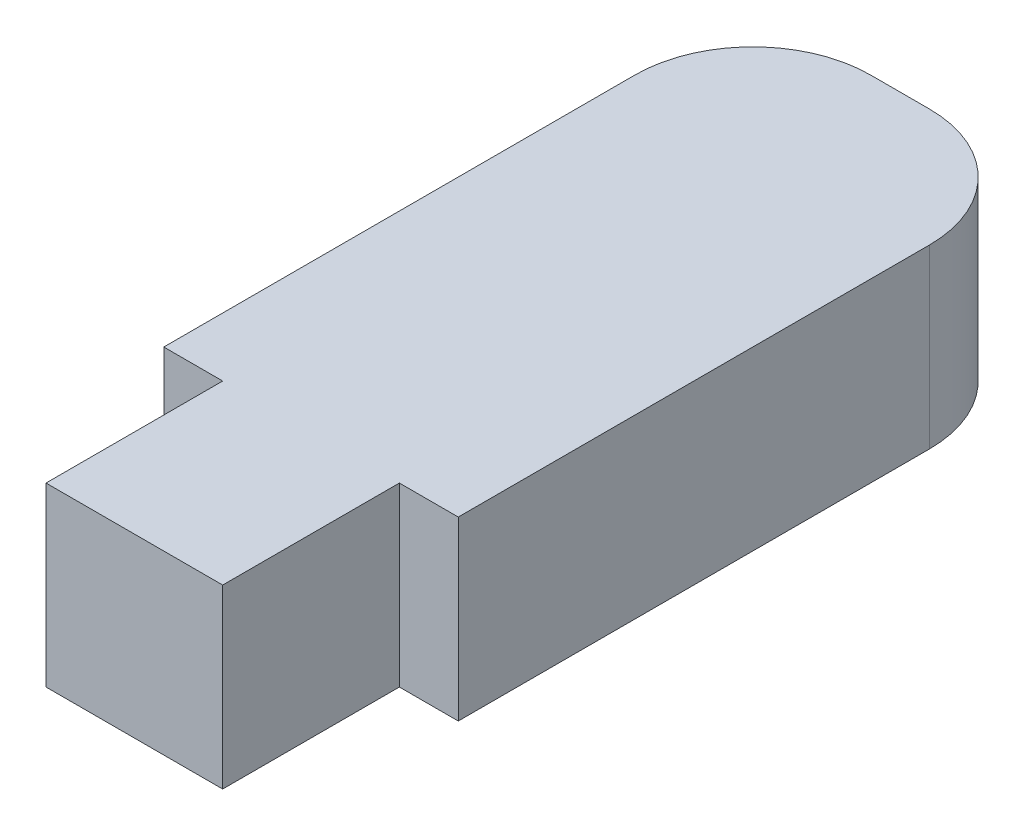
ISO-10303-21;
HEADER;
FILE_DESCRIPTION(('STEP AP214'),'2;1');
FILE_NAME('part.step','',(''),(''),'','','');
FILE_SCHEMA(('AUTOMOTIVE_DESIGN { 1 0 10303 214 1 1 1 1 }'));
ENDSEC;
DATA;
#1=APPLICATION_CONTEXT('core data for automotive mechanical design processes');
#2=APPLICATION_PROTOCOL_DEFINITION('international standard','automotive_design',2000,#1);
#3=PRODUCT_CONTEXT('',#1,'mechanical');
#4=PRODUCT('Part','Part','',(#3));
#5=PRODUCT_RELATED_PRODUCT_CATEGORY('part','',(#4));
#6=PRODUCT_DEFINITION_FORMATION('','',#4);
#7=PRODUCT_DEFINITION_CONTEXT('part definition',#1,'design');
#8=PRODUCT_DEFINITION('design','',#6,#7);
#9=PRODUCT_DEFINITION_SHAPE('','',#8);
#10=(LENGTH_UNIT() NAMED_UNIT(*) SI_UNIT(.MILLI.,.METRE.));
#11=(NAMED_UNIT(*) PLANE_ANGLE_UNIT() SI_UNIT($,.RADIAN.));
#12=(NAMED_UNIT(*) SI_UNIT($,.STERADIAN.) SOLID_ANGLE_UNIT());
#13=UNCERTAINTY_MEASURE_WITH_UNIT(LENGTH_MEASURE(1.E-05),#10,'distance_accuracy_value','');
#14=(GEOMETRIC_REPRESENTATION_CONTEXT(3) GLOBAL_UNCERTAINTY_ASSIGNED_CONTEXT((#13)) GLOBAL_UNIT_ASSIGNED_CONTEXT((#10,
#11,#12)) REPRESENTATION_CONTEXT('',''));
#15=CARTESIAN_POINT('',(0.,0.,0.));
#16=DIRECTION('',(0.,0.,1.));
#17=DIRECTION('',(1.,0.,0.));
#18=AXIS2_PLACEMENT_3D('',#15,#16,#17);
#19=CARTESIAN_POINT('',(0.,3.,0.));
#20=DIRECTION('',(-1.,0.,0.));
#21=DIRECTION('',(0.,0.,1.));
#22=AXIS2_PLACEMENT_3D('',#19,#20,#21);
#23=PLANE('',#22);
#24=DIRECTION('',(0.,0.,-1.));
#25=VECTOR('',#24,1.);
#26=CARTESIAN_POINT('',(0.,0.,0.));
#27=LINE('',#26,#25);
#28=CARTESIAN_POINT('',(0.,0.,0.));
#29=VERTEX_POINT('',#28);
#30=CARTESIAN_POINT('',(0.,0.,-7.99999999999999));
#31=VERTEX_POINT('',#30);
#32=EDGE_CURVE('E141',#29,#31,#27,.T.);
#33=ORIENTED_EDGE('',*,*,#32,.T.);
#34=DIRECTION('',(0.,-1.,0.));
#35=VECTOR('',#34,1.);
#36=CARTESIAN_POINT('',(0.,3.,-7.99999999999999));
#37=LINE('',#36,#35);
#38=CARTESIAN_POINT('',(0.,3.,-7.99999999999999));
#39=VERTEX_POINT('',#38);
#40=EDGE_CURVE('E11',#39,#31,#37,.T.);
#41=ORIENTED_EDGE('',*,*,#40,.F.);
#42=DIRECTION('',(0.,0.,-1.));
#43=VECTOR('',#42,1.);
#44=CARTESIAN_POINT('',(0.,3.,0.));
#45=LINE('',#44,#43);
#46=CARTESIAN_POINT('',(0.,3.,0.));
#47=VERTEX_POINT('',#46);
#48=EDGE_CURVE('E159',#47,#39,#45,.T.);
#49=ORIENTED_EDGE('',*,*,#48,.F.);
#50=DIRECTION('',(0.,-1.,0.));
#51=VECTOR('',#50,1.);
#52=CARTESIAN_POINT('',(0.,3.,0.));
#53=LINE('',#52,#51);
#54=EDGE_CURVE('E137',#47,#29,#53,.T.);
#55=ORIENTED_EDGE('',*,*,#54,.T.);
#56=EDGE_LOOP('',(#33,#41,#49,#55));
#57=FACE_BOUND('',#56,.T.);
#58=ADVANCED_FACE('F33',(#57),#23,.F.);
#59=CARTESIAN_POINT('',(-2.,3.,-8.));
#60=DIRECTION('',(0.,-1.,0.));
#61=DIRECTION('',(0.,0.,-1.));
#62=AXIS2_PLACEMENT_3D('',#59,#60,#61);
#63=CYLINDRICAL_SURFACE('',#62,2.);
#64=CARTESIAN_POINT('',(-2.,0.,-8.));
#65=DIRECTION('',(0.,1.,0.));
#66=DIRECTION('',(0.,0.,1.));
#67=AXIS2_PLACEMENT_3D('',#64,#65,#66);
#68=CIRCLE('',#67,2.);
#69=CARTESIAN_POINT('',(-2.00000000000001,0.,-10.));
#70=VERTEX_POINT('',#69);
#71=EDGE_CURVE('E144',#31,#70,#68,.T.);
#72=ORIENTED_EDGE('',*,*,#71,.T.);
#73=DIRECTION('',(0.,-1.,0.));
#74=VECTOR('',#73,1.);
#75=CARTESIAN_POINT('',(-2.00000000000001,3.,-10.));
#76=LINE('',#75,#74);
#77=CARTESIAN_POINT('',(-2.00000000000001,3.,-10.));
#78=VERTEX_POINT('',#77);
#79=EDGE_CURVE('E41',#78,#70,#76,.T.);
#80=ORIENTED_EDGE('',*,*,#79,.F.);
#81=CARTESIAN_POINT('',(-2.,3.,-8.));
#82=DIRECTION('',(0.,1.,0.));
#83=DIRECTION('',(0.,0.,1.));
#84=AXIS2_PLACEMENT_3D('',#81,#82,#83);
#85=CIRCLE('',#84,2.);
#86=EDGE_CURVE('E98',#39,#78,#85,.T.);
#87=ORIENTED_EDGE('',*,*,#86,.F.);
#88=ORIENTED_EDGE('',*,*,#40,.T.);
#89=EDGE_LOOP('',(#72,#80,#87,#88));
#90=FACE_BOUND('',#89,.T.);
#91=ADVANCED_FACE('F208',(#90),#63,.T.);
#92=CARTESIAN_POINT('',(-2.00000000000001,3.,-10.));
#93=DIRECTION('',(0.,0.,1.));
#94=DIRECTION('',(1.,0.,0.));
#95=AXIS2_PLACEMENT_3D('',#92,#93,#94);
#96=PLANE('',#95);
#97=DIRECTION('',(-1.,0.,0.));
#98=VECTOR('',#97,1.);
#99=CARTESIAN_POINT('',(-2.00000000000001,0.,-10.));
#100=LINE('',#99,#98);
#101=CARTESIAN_POINT('',(-3.,0.,-10.));
#102=VERTEX_POINT('',#101);
#103=EDGE_CURVE('E146',#70,#102,#100,.T.);
#104=ORIENTED_EDGE('',*,*,#103,.T.);
#105=DIRECTION('',(0.,-1.,0.));
#106=VECTOR('',#105,1.);
#107=CARTESIAN_POINT('',(-3.,3.,-10.));
#108=LINE('',#107,#106);
#109=CARTESIAN_POINT('',(-3.,3.,-10.));
#110=VERTEX_POINT('',#109);
#111=EDGE_CURVE('E172',#110,#102,#108,.T.);
#112=ORIENTED_EDGE('',*,*,#111,.F.);
#113=DIRECTION('',(-1.,0.,0.));
#114=VECTOR('',#113,1.);
#115=CARTESIAN_POINT('',(-2.00000000000001,3.,-10.));
#116=LINE('',#115,#114);
#117=EDGE_CURVE('E180',#78,#110,#116,.T.);
#118=ORIENTED_EDGE('',*,*,#117,.F.);
#119=ORIENTED_EDGE('',*,*,#79,.T.);
#120=EDGE_LOOP('',(#104,#112,#118,#119));
#121=FACE_BOUND('',#120,.T.);
#122=ADVANCED_FACE('F178',(#121),#96,.F.);
#123=CARTESIAN_POINT('',(-3.,3.,-8.));
#124=DIRECTION('',(0.,-1.,0.));
#125=DIRECTION('',(0.,0.,-1.));
#126=AXIS2_PLACEMENT_3D('',#123,#124,#125);
#127=CYLINDRICAL_SURFACE('',#126,2.);
#128=CARTESIAN_POINT('',(-3.,0.,-8.));
#129=DIRECTION('',(0.,1.,0.));
#130=DIRECTION('',(0.,0.,-1.));
#131=AXIS2_PLACEMENT_3D('',#128,#129,#130);
#132=CIRCLE('',#131,2.);
#133=CARTESIAN_POINT('',(-5.,0.,-7.99999999999999));
#134=VERTEX_POINT('',#133);
#135=EDGE_CURVE('E148',#102,#134,#132,.T.);
#136=ORIENTED_EDGE('',*,*,#135,.T.);
#137=DIRECTION('',(0.,-1.,0.));
#138=VECTOR('',#137,1.);
#139=CARTESIAN_POINT('',(-5.,3.,-7.99999999999999));
#140=LINE('',#139,#138);
#141=CARTESIAN_POINT('',(-5.,3.,-7.99999999999999));
#142=VERTEX_POINT('',#141);
#143=EDGE_CURVE('E169',#142,#134,#140,.T.);
#144=ORIENTED_EDGE('',*,*,#143,.F.);
#145=CARTESIAN_POINT('',(-3.,3.,-8.));
#146=DIRECTION('',(0.,1.,0.));
#147=DIRECTION('',(0.,0.,-1.));
#148=AXIS2_PLACEMENT_3D('',#145,#146,#147);
#149=CIRCLE('',#148,2.);
#150=EDGE_CURVE('E198',#110,#142,#149,.T.);
#151=ORIENTED_EDGE('',*,*,#150,.F.);
#152=ORIENTED_EDGE('',*,*,#111,.T.);
#153=EDGE_LOOP('',(#136,#144,#151,#152));
#154=FACE_BOUND('',#153,.T.);
#155=ADVANCED_FACE('F189',(#154),#127,.T.);
#156=CARTESIAN_POINT('',(-5.,3.,0.));
#157=DIRECTION('',(1.,0.,0.));
#158=DIRECTION('',(0.,0.,-1.));
#159=AXIS2_PLACEMENT_3D('',#156,#157,#158);
#160=PLANE('',#159);
#161=DIRECTION('',(0.,0.,1.));
#162=VECTOR('',#161,1.);
#163=CARTESIAN_POINT('',(-5.,0.,0.));
#164=LINE('',#163,#162);
#165=CARTESIAN_POINT('',(-5.,0.,0.));
#166=VERTEX_POINT('',#165);
#167=EDGE_CURVE('E150',#134,#166,#164,.T.);
#168=ORIENTED_EDGE('',*,*,#167,.T.);
#169=DIRECTION('',(0.,-1.,0.));
#170=VECTOR('',#169,1.);
#171=CARTESIAN_POINT('',(-5.,3.,0.));
#172=LINE('',#171,#170);
#173=CARTESIAN_POINT('',(-5.,3.,0.));
#174=VERTEX_POINT('',#173);
#175=EDGE_CURVE('E166',#174,#166,#172,.T.);
#176=ORIENTED_EDGE('',*,*,#175,.F.);
#177=DIRECTION('',(0.,0.,1.));
#178=VECTOR('',#177,1.);
#179=CARTESIAN_POINT('',(-5.,3.,0.));
#180=LINE('',#179,#178);
#181=EDGE_CURVE('E195',#142,#174,#180,.T.);
#182=ORIENTED_EDGE('',*,*,#181,.F.);
#183=ORIENTED_EDGE('',*,*,#143,.T.);
#184=EDGE_LOOP('',(#168,#176,#182,#183));
#185=FACE_BOUND('',#184,.T.);
#186=ADVANCED_FACE('F193',(#185),#160,.F.);
#187=CARTESIAN_POINT('',(-4.,3.,0.));
#188=DIRECTION('',(0.,0.,-1.));
#189=DIRECTION('',(-1.,0.,0.));
#190=AXIS2_PLACEMENT_3D('',#187,#188,#189);
#191=PLANE('',#190);
#192=DIRECTION('',(1.,0.,0.));
#193=VECTOR('',#192,1.);
#194=CARTESIAN_POINT('',(-4.,0.,0.));
#195=LINE('',#194,#193);
#196=CARTESIAN_POINT('',(-4.,0.,0.));
#197=VERTEX_POINT('',#196);
#198=EDGE_CURVE('E152',#166,#197,#195,.T.);
#199=ORIENTED_EDGE('',*,*,#198,.T.);
#200=DIRECTION('',(0.,-1.,0.));
#201=VECTOR('',#200,1.);
#202=CARTESIAN_POINT('',(-4.,3.,0.));
#203=LINE('',#202,#201);
#204=CARTESIAN_POINT('',(-4.,3.,0.));
#205=VERTEX_POINT('',#204);
#206=EDGE_CURVE('E163',#205,#197,#203,.T.);
#207=ORIENTED_EDGE('',*,*,#206,.F.);
#208=DIRECTION('',(1.,0.,0.));
#209=VECTOR('',#208,1.);
#210=CARTESIAN_POINT('',(-4.,3.,0.));
#211=LINE('',#210,#209);
#212=EDGE_CURVE('E197',#174,#205,#211,.T.);
#213=ORIENTED_EDGE('',*,*,#212,.F.);
#214=ORIENTED_EDGE('',*,*,#175,.T.);
#215=EDGE_LOOP('',(#199,#207,#213,#214));
#216=FACE_BOUND('',#215,.T.);
#217=ADVANCED_FACE('F220',(#216),#191,.F.);
#218=CARTESIAN_POINT('',(-4.,3.,3.));
#219=DIRECTION('',(1.,0.,0.));
#220=DIRECTION('',(0.,0.,-1.));
#221=AXIS2_PLACEMENT_3D('',#218,#219,#220);
#222=PLANE('',#221);
#223=DIRECTION('',(0.,0.,1.));
#224=VECTOR('',#223,1.);
#225=CARTESIAN_POINT('',(-4.,0.,3.));
#226=LINE('',#225,#224);
#227=CARTESIAN_POINT('',(-4.,0.,3.));
#228=VERTEX_POINT('',#227);
#229=EDGE_CURVE('E154',#197,#228,#226,.T.);
#230=ORIENTED_EDGE('',*,*,#229,.T.);
#231=DIRECTION('',(0.,-1.,0.));
#232=VECTOR('',#231,1.);
#233=CARTESIAN_POINT('',(-4.,3.,3.));
#234=LINE('',#233,#232);
#235=CARTESIAN_POINT('',(-4.,3.,3.));
#236=VERTEX_POINT('',#235);
#237=EDGE_CURVE('E132',#236,#228,#234,.T.);
#238=ORIENTED_EDGE('',*,*,#237,.F.);
#239=DIRECTION('',(0.,0.,1.));
#240=VECTOR('',#239,1.);
#241=CARTESIAN_POINT('',(-4.,3.,3.));
#242=LINE('',#241,#240);
#243=EDGE_CURVE('E123',#205,#236,#242,.T.);
#244=ORIENTED_EDGE('',*,*,#243,.F.);
#245=ORIENTED_EDGE('',*,*,#206,.T.);
#246=EDGE_LOOP('',(#230,#238,#244,#245));
#247=FACE_BOUND('',#246,.T.);
#248=ADVANCED_FACE('F223',(#247),#222,.F.);
#249=CARTESIAN_POINT('',(-1.,3.,3.));
#250=DIRECTION('',(0.,0.,-1.));
#251=DIRECTION('',(-1.,0.,0.));
#252=AXIS2_PLACEMENT_3D('',#249,#250,#251);
#253=PLANE('',#252);
#254=DIRECTION('',(1.,0.,0.));
#255=VECTOR('',#254,1.);
#256=CARTESIAN_POINT('',(-1.,0.,3.));
#257=LINE('',#256,#255);
#258=CARTESIAN_POINT('',(-1.,0.,3.));
#259=VERTEX_POINT('',#258);
#260=EDGE_CURVE('E131',#228,#259,#257,.T.);
#261=ORIENTED_EDGE('',*,*,#260,.T.);
#262=DIRECTION('',(0.,-1.,0.));
#263=VECTOR('',#262,1.);
#264=CARTESIAN_POINT('',(-1.,3.,3.));
#265=LINE('',#264,#263);
#266=CARTESIAN_POINT('',(-1.,3.,3.));
#267=VERTEX_POINT('',#266);
#268=EDGE_CURVE('E128',#267,#259,#265,.T.);
#269=ORIENTED_EDGE('',*,*,#268,.F.);
#270=DIRECTION('',(1.,0.,0.));
#271=VECTOR('',#270,1.);
#272=CARTESIAN_POINT('',(-1.,3.,3.));
#273=LINE('',#272,#271);
#274=EDGE_CURVE('E117',#236,#267,#273,.T.);
#275=ORIENTED_EDGE('',*,*,#274,.F.);
#276=ORIENTED_EDGE('',*,*,#237,.T.);
#277=EDGE_LOOP('',(#261,#269,#275,#276));
#278=FACE_BOUND('',#277,.T.);
#279=ADVANCED_FACE('F129',(#278),#253,.F.);
#280=CARTESIAN_POINT('',(-1.,3.,3.));
#281=DIRECTION('',(-1.,0.,0.));
#282=DIRECTION('',(0.,0.,1.));
#283=AXIS2_PLACEMENT_3D('',#280,#281,#282);
#284=PLANE('',#283);
#285=DIRECTION('',(0.,0.,-1.));
#286=VECTOR('',#285,1.);
#287=CARTESIAN_POINT('',(-1.,0.,3.));
#288=LINE('',#287,#286);
#289=CARTESIAN_POINT('',(-1.,0.,0.));
#290=VERTEX_POINT('',#289);
#291=EDGE_CURVE('E84',#259,#290,#288,.T.);
#292=ORIENTED_EDGE('',*,*,#291,.T.);
#293=DIRECTION('',(0.,-1.,0.));
#294=VECTOR('',#293,1.);
#295=CARTESIAN_POINT('',(-1.,3.,0.));
#296=LINE('',#295,#294);
#297=CARTESIAN_POINT('',(-1.,3.,0.));
#298=VERTEX_POINT('',#297);
#299=EDGE_CURVE('E133',#298,#290,#296,.T.);
#300=ORIENTED_EDGE('',*,*,#299,.F.);
#301=DIRECTION('',(0.,0.,-1.));
#302=VECTOR('',#301,1.);
#303=CARTESIAN_POINT('',(-1.,3.,3.));
#304=LINE('',#303,#302);
#305=EDGE_CURVE('E121',#267,#298,#304,.T.);
#306=ORIENTED_EDGE('',*,*,#305,.F.);
#307=ORIENTED_EDGE('',*,*,#268,.T.);
#308=EDGE_LOOP('',(#292,#300,#306,#307));
#309=FACE_BOUND('',#308,.T.);
#310=ADVANCED_FACE('F135',(#309),#284,.F.);
#311=CARTESIAN_POINT('',(0.,3.,0.));
#312=DIRECTION('',(0.,0.,-1.));
#313=DIRECTION('',(-1.,0.,0.));
#314=AXIS2_PLACEMENT_3D('',#311,#312,#313);
#315=PLANE('',#314);
#316=DIRECTION('',(1.,0.,0.));
#317=VECTOR('',#316,1.);
#318=CARTESIAN_POINT('',(0.,0.,0.));
#319=LINE('',#318,#317);
#320=EDGE_CURVE('E90',#290,#29,#319,.T.);
#321=ORIENTED_EDGE('',*,*,#320,.T.);
#322=ORIENTED_EDGE('',*,*,#54,.F.);
#323=DIRECTION('',(1.,0.,0.));
#324=VECTOR('',#323,1.);
#325=CARTESIAN_POINT('',(0.,3.,0.));
#326=LINE('',#325,#324);
#327=EDGE_CURVE('E49',#298,#47,#326,.T.);
#328=ORIENTED_EDGE('',*,*,#327,.F.);
#329=ORIENTED_EDGE('',*,*,#299,.T.);
#330=EDGE_LOOP('',(#321,#322,#328,#329));
#331=FACE_BOUND('',#330,.T.);
#332=ADVANCED_FACE('F232',(#331),#315,.F.);
#333=CARTESIAN_POINT('',(-2.,3.,-8.));
#334=DIRECTION('',(0.,1.,0.));
#335=DIRECTION('',(0.,0.,1.));
#336=AXIS2_PLACEMENT_3D('',#333,#334,#335);
#337=PLANE('',#336);
#338=ORIENTED_EDGE('',*,*,#48,.T.);
#339=ORIENTED_EDGE('',*,*,#86,.T.);
#340=ORIENTED_EDGE('',*,*,#117,.T.);
#341=ORIENTED_EDGE('',*,*,#150,.T.);
#342=ORIENTED_EDGE('',*,*,#181,.T.);
#343=ORIENTED_EDGE('',*,*,#212,.T.);
#344=ORIENTED_EDGE('',*,*,#243,.T.);
#345=ORIENTED_EDGE('',*,*,#274,.T.);
#346=ORIENTED_EDGE('',*,*,#305,.T.);
#347=ORIENTED_EDGE('',*,*,#327,.T.);
#348=EDGE_LOOP('',(#338,#339,#340,#341,#342,#343,#344,#345,#346,#347));
#349=FACE_BOUND('',#348,.T.);
#350=ADVANCED_FACE('F119',(#349),#337,.T.);
#351=CARTESIAN_POINT('',(-2.,0.,-8.));
#352=DIRECTION('',(0.,1.,0.));
#353=DIRECTION('',(0.,0.,1.));
#354=AXIS2_PLACEMENT_3D('',#351,#352,#353);
#355=PLANE('',#354);
#356=ORIENTED_EDGE('',*,*,#32,.F.);
#357=ORIENTED_EDGE('',*,*,#320,.F.);
#358=ORIENTED_EDGE('',*,*,#291,.F.);
#359=ORIENTED_EDGE('',*,*,#260,.F.);
#360=ORIENTED_EDGE('',*,*,#229,.F.);
#361=ORIENTED_EDGE('',*,*,#198,.F.);
#362=ORIENTED_EDGE('',*,*,#167,.F.);
#363=ORIENTED_EDGE('',*,*,#135,.F.);
#364=ORIENTED_EDGE('',*,*,#103,.F.);
#365=ORIENTED_EDGE('',*,*,#71,.F.);
#366=EDGE_LOOP('',(#356,#357,#358,#359,#360,#361,#362,#363,#364,#365));
#367=FACE_BOUND('',#366,.T.);
#368=ADVANCED_FACE('F184',(#367),#355,.F.);
#369=CLOSED_SHELL('',(#58,#91,#122,#155,#186,#217,#248,#279,#310,#332,#350,#368));
#370=MANIFOLD_SOLID_BREP('B2',#369);
#371=ADVANCED_BREP_SHAPE_REPRESENTATION('',(#18,#370),#14);
#372=SHAPE_DEFINITION_REPRESENTATION(#9,#371);
ENDSEC;
END-ISO-10303-21;
